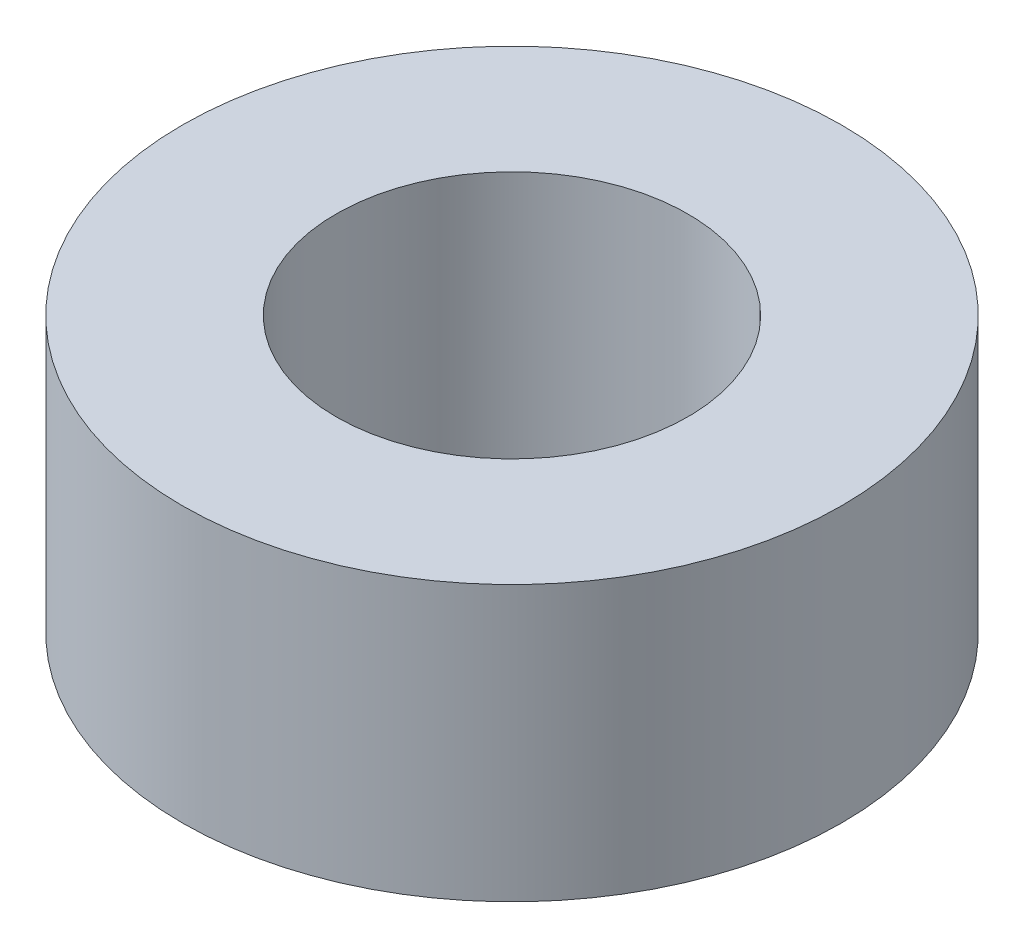
ISO-10303-21;
HEADER;
FILE_DESCRIPTION(('STEP AP214'),'2;1');
FILE_NAME('part.step','',(''),(''),'','','');
FILE_SCHEMA(('AUTOMOTIVE_DESIGN { 1 0 10303 214 1 1 1 1 }'));
ENDSEC;
DATA;
#1=APPLICATION_CONTEXT('core data for automotive mechanical design processes');
#2=APPLICATION_PROTOCOL_DEFINITION('international standard','automotive_design',2000,#1);
#3=PRODUCT_CONTEXT('',#1,'mechanical');
#4=PRODUCT('Part','Part','',(#3));
#5=PRODUCT_RELATED_PRODUCT_CATEGORY('part','',(#4));
#6=PRODUCT_DEFINITION_FORMATION('','',#4);
#7=PRODUCT_DEFINITION_CONTEXT('part definition',#1,'design');
#8=PRODUCT_DEFINITION('design','',#6,#7);
#9=PRODUCT_DEFINITION_SHAPE('','',#8);
#10=(LENGTH_UNIT() NAMED_UNIT(*) SI_UNIT(.MILLI.,.METRE.));
#11=(NAMED_UNIT(*) PLANE_ANGLE_UNIT() SI_UNIT($,.RADIAN.));
#12=(NAMED_UNIT(*) SI_UNIT($,.STERADIAN.) SOLID_ANGLE_UNIT());
#13=UNCERTAINTY_MEASURE_WITH_UNIT(LENGTH_MEASURE(1.E-05),#10,'distance_accuracy_value','');
#14=(GEOMETRIC_REPRESENTATION_CONTEXT(3) GLOBAL_UNCERTAINTY_ASSIGNED_CONTEXT((#13)) GLOBAL_UNIT_ASSIGNED_CONTEXT((#10,
#11,#12)) REPRESENTATION_CONTEXT('',''));
#15=CARTESIAN_POINT('',(0.,0.,0.));
#16=DIRECTION('',(0.,0.,1.));
#17=DIRECTION('',(1.,0.,0.));
#18=AXIS2_PLACEMENT_3D('',#15,#16,#17);
#19=CARTESIAN_POINT('',(0.,2.5,0.));
#20=DIRECTION('',(0.,1.,0.));
#21=DIRECTION('',(0.,0.,1.));
#22=AXIS2_PLACEMENT_3D('',#19,#20,#21);
#23=PLANE('',#22);
#24=CARTESIAN_POINT('',(0.,2.5,0.));
#25=DIRECTION('',(0.,1.,0.));
#26=DIRECTION('',(0.,0.,1.));
#27=AXIS2_PLACEMENT_3D('',#24,#25,#26);
#28=CIRCLE('',#27,3.);
#29=CARTESIAN_POINT('',(0.,2.5,3.));
#30=VERTEX_POINT('',#29);
#31=EDGE_CURVE('E10',#30,#30,#28,.T.);
#32=ORIENTED_EDGE('',*,*,#31,.T.);
#33=EDGE_LOOP('',(#32));
#34=FACE_BOUND('',#33,.T.);
#35=CARTESIAN_POINT('',(0.,2.5,0.));
#36=DIRECTION('',(0.,1.,0.));
#37=DIRECTION('',(0.,0.,1.));
#38=AXIS2_PLACEMENT_3D('',#35,#36,#37);
#39=CIRCLE('',#38,1.6);
#40=CARTESIAN_POINT('',(0.,2.5,1.6));
#41=VERTEX_POINT('',#40);
#42=EDGE_CURVE('E56',#41,#41,#39,.T.);
#43=ORIENTED_EDGE('',*,*,#42,.F.);
#44=EDGE_LOOP('',(#43));
#45=FACE_BOUND('',#44,.T.);
#46=ADVANCED_FACE('F43',(#34,#45),#23,.T.);
#47=CARTESIAN_POINT('',(0.,0.,0.));
#48=DIRECTION('',(0.,1.,0.));
#49=DIRECTION('',(0.,0.,1.));
#50=AXIS2_PLACEMENT_3D('',#47,#48,#49);
#51=PLANE('',#50);
#52=CARTESIAN_POINT('',(0.,0.,0.));
#53=DIRECTION('',(0.,1.,0.));
#54=DIRECTION('',(0.,0.,1.));
#55=AXIS2_PLACEMENT_3D('',#52,#53,#54);
#56=CIRCLE('',#55,3.);
#57=CARTESIAN_POINT('',(0.,0.,3.));
#58=VERTEX_POINT('',#57);
#59=EDGE_CURVE('E47',#58,#58,#56,.T.);
#60=ORIENTED_EDGE('',*,*,#59,.F.);
#61=EDGE_LOOP('',(#60));
#62=FACE_BOUND('',#61,.T.);
#63=CARTESIAN_POINT('',(0.,0.,0.));
#64=DIRECTION('',(0.,1.,0.));
#65=DIRECTION('',(0.,0.,1.));
#66=AXIS2_PLACEMENT_3D('',#63,#64,#65);
#67=CIRCLE('',#66,1.6);
#68=CARTESIAN_POINT('',(0.,0.,1.6));
#69=VERTEX_POINT('',#68);
#70=EDGE_CURVE('E58',#69,#69,#67,.T.);
#71=ORIENTED_EDGE('',*,*,#70,.T.);
#72=EDGE_LOOP('',(#71));
#73=FACE_BOUND('',#72,.T.);
#74=ADVANCED_FACE('F70',(#62,#73),#51,.F.);
#75=CARTESIAN_POINT('',(0.,2.5,0.));
#76=DIRECTION('',(0.,-1.,0.));
#77=DIRECTION('',(0.,0.,-1.));
#78=AXIS2_PLACEMENT_3D('',#75,#76,#77);
#79=CYLINDRICAL_SURFACE('',#78,3.);
#80=ORIENTED_EDGE('',*,*,#31,.F.);
#81=EDGE_LOOP('',(#80));
#82=FACE_BOUND('',#81,.T.);
#83=ORIENTED_EDGE('',*,*,#59,.T.);
#84=EDGE_LOOP('',(#83));
#85=FACE_BOUND('',#84,.T.);
#86=ADVANCED_FACE('F45',(#82,#85),#79,.T.);
#87=CARTESIAN_POINT('',(0.,2.5,0.));
#88=DIRECTION('',(0.,-1.,0.));
#89=DIRECTION('',(0.,0.,-1.));
#90=AXIS2_PLACEMENT_3D('',#87,#88,#89);
#91=CYLINDRICAL_SURFACE('',#90,1.6);
#92=ORIENTED_EDGE('',*,*,#42,.T.);
#93=EDGE_LOOP('',(#92));
#94=FACE_BOUND('',#93,.T.);
#95=ORIENTED_EDGE('',*,*,#70,.F.);
#96=EDGE_LOOP('',(#95));
#97=FACE_BOUND('',#96,.T.);
#98=ADVANCED_FACE('F66',(#94,#97),#91,.F.);
#99=CLOSED_SHELL('',(#46,#74,#86,#98));
#100=MANIFOLD_SOLID_BREP('B2',#99);
#101=ADVANCED_BREP_SHAPE_REPRESENTATION('',(#18,#100),#14);
#102=SHAPE_DEFINITION_REPRESENTATION(#9,#101);
ENDSEC;
END-ISO-10303-21;
